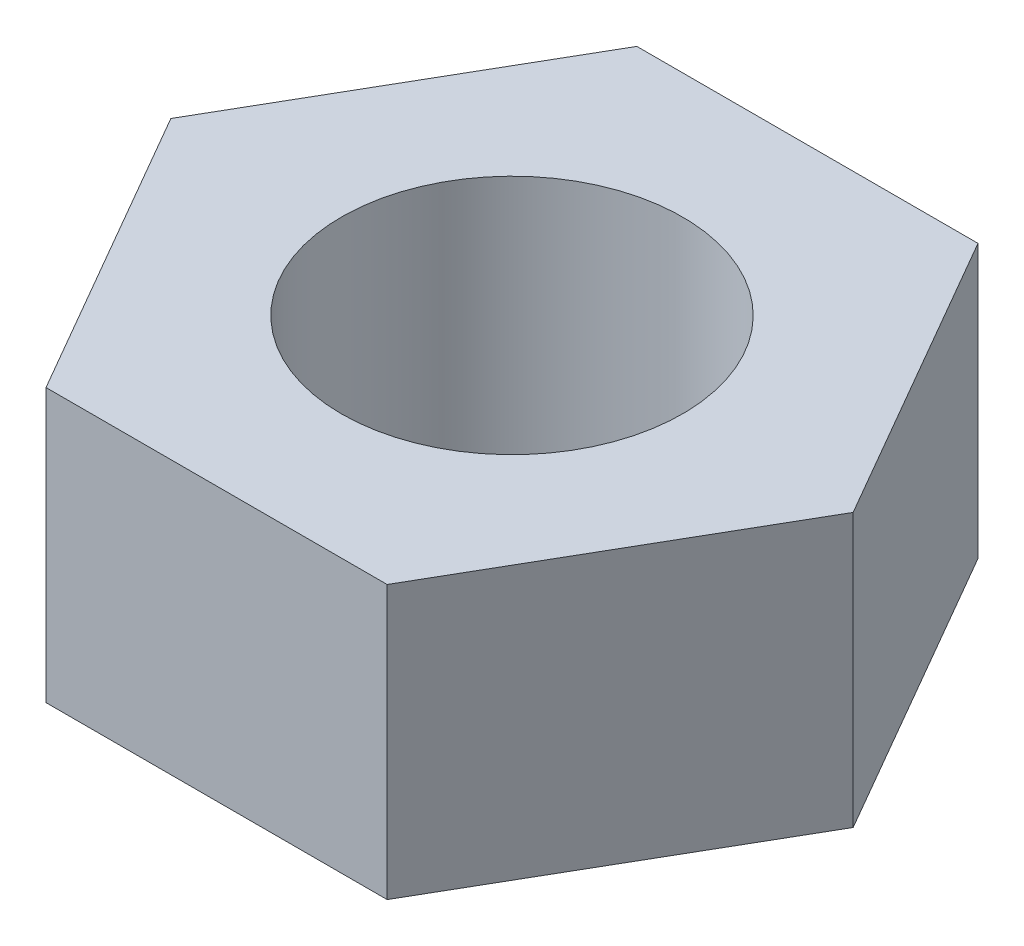
ISO-10303-21;
HEADER;
FILE_DESCRIPTION(('STEP AP214'),'2;1');
FILE_NAME('part.step','',(''),(''),'','','');
FILE_SCHEMA(('AUTOMOTIVE_DESIGN { 1 0 10303 214 1 1 1 1 }'));
ENDSEC;
DATA;
#1=APPLICATION_CONTEXT('core data for automotive mechanical design processes');
#2=APPLICATION_PROTOCOL_DEFINITION('international standard','automotive_design',2000,#1);
#3=PRODUCT_CONTEXT('',#1,'mechanical');
#4=PRODUCT('Part','Part','',(#3));
#5=PRODUCT_RELATED_PRODUCT_CATEGORY('part','',(#4));
#6=PRODUCT_DEFINITION_FORMATION('','',#4);
#7=PRODUCT_DEFINITION_CONTEXT('part definition',#1,'design');
#8=PRODUCT_DEFINITION('design','',#6,#7);
#9=PRODUCT_DEFINITION_SHAPE('','',#8);
#10=(LENGTH_UNIT() NAMED_UNIT(*) SI_UNIT(.MILLI.,.METRE.));
#11=(NAMED_UNIT(*) PLANE_ANGLE_UNIT() SI_UNIT($,.RADIAN.));
#12=(NAMED_UNIT(*) SI_UNIT($,.STERADIAN.) SOLID_ANGLE_UNIT());
#13=UNCERTAINTY_MEASURE_WITH_UNIT(LENGTH_MEASURE(1.E-05),#10,'distance_accuracy_value','');
#14=(GEOMETRIC_REPRESENTATION_CONTEXT(3) GLOBAL_UNCERTAINTY_ASSIGNED_CONTEXT((#13)) GLOBAL_UNIT_ASSIGNED_CONTEXT((#10,
#11,#12)) REPRESENTATION_CONTEXT('',''));
#15=CARTESIAN_POINT('',(0.,0.,0.));
#16=DIRECTION('',(0.,0.,1.));
#17=DIRECTION('',(1.,0.,0.));
#18=AXIS2_PLACEMENT_3D('',#15,#16,#17);
#19=CARTESIAN_POINT('',(0.,3.2,0.));
#20=DIRECTION('',(0.,1.,0.));
#21=DIRECTION('',(0.,0.,1.));
#22=AXIS2_PLACEMENT_3D('',#19,#20,#21);
#23=PLANE('',#22);
#24=DIRECTION('',(0.5,0.,-0.866025403784439));
#25=VECTOR('',#24,1.);
#26=CARTESIAN_POINT('',(2.,3.2,3.46410161513776));
#27=LINE('',#26,#25);
#28=CARTESIAN_POINT('',(2.,3.2,3.46410161513776));
#29=VERTEX_POINT('',#28);
#30=CARTESIAN_POINT('',(4.,3.2,0.));
#31=VERTEX_POINT('',#30);
#32=EDGE_CURVE('E130',#29,#31,#27,.T.);
#33=ORIENTED_EDGE('',*,*,#32,.T.);
#34=DIRECTION('',(-0.5,0.,-0.866025403784438));
#35=VECTOR('',#34,1.);
#36=CARTESIAN_POINT('',(4.,3.2,0.));
#37=LINE('',#36,#35);
#38=CARTESIAN_POINT('',(2.,3.2,-3.46410161513775));
#39=VERTEX_POINT('',#38);
#40=EDGE_CURVE('E88',#31,#39,#37,.T.);
#41=ORIENTED_EDGE('',*,*,#40,.T.);
#42=DIRECTION('',(-1.,0.,0.));
#43=VECTOR('',#42,1.);
#44=CARTESIAN_POINT('',(2.,3.2,-3.46410161513775));
#45=LINE('',#44,#43);
#46=CARTESIAN_POINT('',(-2.,3.2,-3.46410161513775));
#47=VERTEX_POINT('',#46);
#48=EDGE_CURVE('E101',#39,#47,#45,.T.);
#49=ORIENTED_EDGE('',*,*,#48,.T.);
#50=DIRECTION('',(-0.5,0.,0.866025403784439));
#51=VECTOR('',#50,1.);
#52=CARTESIAN_POINT('',(-2.,3.2,-3.46410161513775));
#53=LINE('',#52,#51);
#54=CARTESIAN_POINT('',(-4.,3.2,0.));
#55=VERTEX_POINT('',#54);
#56=EDGE_CURVE('E95',#47,#55,#53,.T.);
#57=ORIENTED_EDGE('',*,*,#56,.T.);
#58=DIRECTION('',(0.5,0.,0.866025403784439));
#59=VECTOR('',#58,1.);
#60=CARTESIAN_POINT('',(-4.,3.2,0.));
#61=LINE('',#60,#59);
#62=CARTESIAN_POINT('',(-2.,3.2,3.46410161513775));
#63=VERTEX_POINT('',#62);
#64=EDGE_CURVE('E99',#55,#63,#61,.T.);
#65=ORIENTED_EDGE('',*,*,#64,.T.);
#66=DIRECTION('',(1.,0.,0.));
#67=VECTOR('',#66,1.);
#68=CARTESIAN_POINT('',(-2.,3.2,3.46410161513775));
#69=LINE('',#68,#67);
#70=EDGE_CURVE('E51',#63,#29,#69,.T.);
#71=ORIENTED_EDGE('',*,*,#70,.T.);
#72=EDGE_LOOP('',(#33,#41,#49,#57,#65,#71));
#73=FACE_BOUND('',#72,.T.);
#74=CARTESIAN_POINT('',(0.,3.2,0.));
#75=DIRECTION('',(0.,1.,0.));
#76=DIRECTION('',(0.,0.,1.));
#77=AXIS2_PLACEMENT_3D('',#74,#75,#76);
#78=CIRCLE('',#77,2.);
#79=CARTESIAN_POINT('',(0.,3.2,2.));
#80=VERTEX_POINT('',#79);
#81=EDGE_CURVE('E123',#80,#80,#78,.T.);
#82=ORIENTED_EDGE('',*,*,#81,.F.);
#83=EDGE_LOOP('',(#82));
#84=FACE_BOUND('',#83,.T.);
#85=ADVANCED_FACE('F34',(#73,#84),#23,.T.);
#86=CARTESIAN_POINT('',(0.,0.,0.));
#87=DIRECTION('',(0.,1.,0.));
#88=DIRECTION('',(0.,0.,1.));
#89=AXIS2_PLACEMENT_3D('',#86,#87,#88);
#90=PLANE('',#89);
#91=DIRECTION('',(0.5,0.,-0.866025403784439));
#92=VECTOR('',#91,1.);
#93=CARTESIAN_POINT('',(2.,0.,3.46410161513776));
#94=LINE('',#93,#92);
#95=CARTESIAN_POINT('',(2.,0.,3.46410161513776));
#96=VERTEX_POINT('',#95);
#97=CARTESIAN_POINT('',(4.,0.,0.));
#98=VERTEX_POINT('',#97);
#99=EDGE_CURVE('E119',#96,#98,#94,.T.);
#100=ORIENTED_EDGE('',*,*,#99,.F.);
#101=DIRECTION('',(1.,0.,0.));
#102=VECTOR('',#101,1.);
#103=CARTESIAN_POINT('',(-2.,0.,3.46410161513775));
#104=LINE('',#103,#102);
#105=CARTESIAN_POINT('',(-2.,0.,3.46410161513775));
#106=VERTEX_POINT('',#105);
#107=EDGE_CURVE('E80',#106,#96,#104,.T.);
#108=ORIENTED_EDGE('',*,*,#107,.F.);
#109=DIRECTION('',(0.5,0.,0.866025403784439));
#110=VECTOR('',#109,1.);
#111=CARTESIAN_POINT('',(-4.,0.,0.));
#112=LINE('',#111,#110);
#113=CARTESIAN_POINT('',(-4.,0.,0.));
#114=VERTEX_POINT('',#113);
#115=EDGE_CURVE('E74',#114,#106,#112,.T.);
#116=ORIENTED_EDGE('',*,*,#115,.F.);
#117=DIRECTION('',(-0.5,0.,0.866025403784439));
#118=VECTOR('',#117,1.);
#119=CARTESIAN_POINT('',(-2.,0.,-3.46410161513775));
#120=LINE('',#119,#118);
#121=CARTESIAN_POINT('',(-2.,0.,-3.46410161513775));
#122=VERTEX_POINT('',#121);
#123=EDGE_CURVE('E109',#122,#114,#120,.T.);
#124=ORIENTED_EDGE('',*,*,#123,.F.);
#125=DIRECTION('',(-1.,0.,0.));
#126=VECTOR('',#125,1.);
#127=CARTESIAN_POINT('',(2.,0.,-3.46410161513775));
#128=LINE('',#127,#126);
#129=CARTESIAN_POINT('',(2.,0.,-3.46410161513775));
#130=VERTEX_POINT('',#129);
#131=EDGE_CURVE('E125',#130,#122,#128,.T.);
#132=ORIENTED_EDGE('',*,*,#131,.F.);
#133=DIRECTION('',(-0.5,0.,-0.866025403784438));
#134=VECTOR('',#133,1.);
#135=CARTESIAN_POINT('',(4.,0.,0.));
#136=LINE('',#135,#134);
#137=EDGE_CURVE('E122',#98,#130,#136,.T.);
#138=ORIENTED_EDGE('',*,*,#137,.F.);
#139=EDGE_LOOP('',(#100,#108,#116,#124,#132,#138));
#140=FACE_BOUND('',#139,.T.);
#141=CARTESIAN_POINT('',(0.,0.,0.));
#142=DIRECTION('',(0.,1.,0.));
#143=DIRECTION('',(0.,0.,1.));
#144=AXIS2_PLACEMENT_3D('',#141,#142,#143);
#145=CIRCLE('',#144,2.);
#146=CARTESIAN_POINT('',(0.,0.,2.));
#147=VERTEX_POINT('',#146);
#148=EDGE_CURVE('E223',#147,#147,#145,.T.);
#149=ORIENTED_EDGE('',*,*,#148,.T.);
#150=EDGE_LOOP('',(#149));
#151=FACE_BOUND('',#150,.T.);
#152=ADVANCED_FACE('F139',(#140,#151),#90,.F.);
#153=CARTESIAN_POINT('',(2.,3.2,3.46410161513776));
#154=DIRECTION('',(-0.866025403784439,0.,-0.5));
#155=DIRECTION('',(-0.5,0.,0.866025403784439));
#156=AXIS2_PLACEMENT_3D('',#153,#154,#155);
#157=PLANE('',#156);
#158=ORIENTED_EDGE('',*,*,#99,.T.);
#159=DIRECTION('',(0.,-1.,0.));
#160=VECTOR('',#159,1.);
#161=CARTESIAN_POINT('',(4.,3.2,0.));
#162=LINE('',#161,#160);
#163=EDGE_CURVE('E11',#31,#98,#162,.T.);
#164=ORIENTED_EDGE('',*,*,#163,.F.);
#165=ORIENTED_EDGE('',*,*,#32,.F.);
#166=DIRECTION('',(0.,-1.,0.));
#167=VECTOR('',#166,1.);
#168=CARTESIAN_POINT('',(2.,3.2,3.46410161513776));
#169=LINE('',#168,#167);
#170=EDGE_CURVE('E115',#29,#96,#169,.T.);
#171=ORIENTED_EDGE('',*,*,#170,.T.);
#172=EDGE_LOOP('',(#158,#164,#165,#171));
#173=FACE_BOUND('',#172,.T.);
#174=ADVANCED_FACE('F36',(#173),#157,.F.);
#175=CARTESIAN_POINT('',(4.,3.2,0.));
#176=DIRECTION('',(-0.866025403784438,0.,0.5));
#177=DIRECTION('',(0.5,0.,0.866025403784439));
#178=AXIS2_PLACEMENT_3D('',#175,#176,#177);
#179=PLANE('',#178);
#180=ORIENTED_EDGE('',*,*,#137,.T.);
#181=DIRECTION('',(0.,-1.,0.));
#182=VECTOR('',#181,1.);
#183=CARTESIAN_POINT('',(2.,3.2,-3.46410161513775));
#184=LINE('',#183,#182);
#185=EDGE_CURVE('E43',#39,#130,#184,.T.);
#186=ORIENTED_EDGE('',*,*,#185,.F.);
#187=ORIENTED_EDGE('',*,*,#40,.F.);
#188=ORIENTED_EDGE('',*,*,#163,.T.);
#189=EDGE_LOOP('',(#180,#186,#187,#188));
#190=FACE_BOUND('',#189,.T.);
#191=ADVANCED_FACE('F164',(#190),#179,.F.);
#192=CARTESIAN_POINT('',(2.,3.2,-3.46410161513775));
#193=DIRECTION('',(0.,0.,1.));
#194=DIRECTION('',(1.,0.,0.));
#195=AXIS2_PLACEMENT_3D('',#192,#193,#194);
#196=PLANE('',#195);
#197=ORIENTED_EDGE('',*,*,#131,.T.);
#198=DIRECTION('',(0.,-1.,0.));
#199=VECTOR('',#198,1.);
#200=CARTESIAN_POINT('',(-2.,3.2,-3.46410161513775));
#201=LINE('',#200,#199);
#202=EDGE_CURVE('E110',#47,#122,#201,.T.);
#203=ORIENTED_EDGE('',*,*,#202,.F.);
#204=ORIENTED_EDGE('',*,*,#48,.F.);
#205=ORIENTED_EDGE('',*,*,#185,.T.);
#206=EDGE_LOOP('',(#197,#203,#204,#205));
#207=FACE_BOUND('',#206,.T.);
#208=ADVANCED_FACE('F136',(#207),#196,.F.);
#209=CARTESIAN_POINT('',(-2.,3.2,-3.46410161513775));
#210=DIRECTION('',(0.866025403784439,0.,0.5));
#211=DIRECTION('',(0.5,0.,-0.866025403784439));
#212=AXIS2_PLACEMENT_3D('',#209,#210,#211);
#213=PLANE('',#212);
#214=ORIENTED_EDGE('',*,*,#123,.T.);
#215=DIRECTION('',(0.,-1.,0.));
#216=VECTOR('',#215,1.);
#217=CARTESIAN_POINT('',(-4.,3.2,0.));
#218=LINE('',#217,#216);
#219=EDGE_CURVE('E106',#55,#114,#218,.T.);
#220=ORIENTED_EDGE('',*,*,#219,.F.);
#221=ORIENTED_EDGE('',*,*,#56,.F.);
#222=ORIENTED_EDGE('',*,*,#202,.T.);
#223=EDGE_LOOP('',(#214,#220,#221,#222));
#224=FACE_BOUND('',#223,.T.);
#225=ADVANCED_FACE('F107',(#224),#213,.F.);
#226=CARTESIAN_POINT('',(-4.,3.2,0.));
#227=DIRECTION('',(0.866025403784439,0.,-0.5));
#228=DIRECTION('',(-0.5,0.,-0.866025403784439));
#229=AXIS2_PLACEMENT_3D('',#226,#227,#228);
#230=PLANE('',#229);
#231=ORIENTED_EDGE('',*,*,#115,.T.);
#232=DIRECTION('',(0.,-1.,0.));
#233=VECTOR('',#232,1.);
#234=CARTESIAN_POINT('',(-2.,3.2,3.46410161513775));
#235=LINE('',#234,#233);
#236=EDGE_CURVE('E111',#63,#106,#235,.T.);
#237=ORIENTED_EDGE('',*,*,#236,.F.);
#238=ORIENTED_EDGE('',*,*,#64,.F.);
#239=ORIENTED_EDGE('',*,*,#219,.T.);
#240=EDGE_LOOP('',(#231,#237,#238,#239));
#241=FACE_BOUND('',#240,.T.);
#242=ADVANCED_FACE('F113',(#241),#230,.F.);
#243=CARTESIAN_POINT('',(-2.,3.2,3.46410161513775));
#244=DIRECTION('',(0.,0.,-1.));
#245=DIRECTION('',(-1.,0.,0.));
#246=AXIS2_PLACEMENT_3D('',#243,#244,#245);
#247=PLANE('',#246);
#248=ORIENTED_EDGE('',*,*,#107,.T.);
#249=ORIENTED_EDGE('',*,*,#170,.F.);
#250=ORIENTED_EDGE('',*,*,#70,.F.);
#251=ORIENTED_EDGE('',*,*,#236,.T.);
#252=EDGE_LOOP('',(#248,#249,#250,#251));
#253=FACE_BOUND('',#252,.T.);
#254=ADVANCED_FACE('F144',(#253),#247,.F.);
#255=CARTESIAN_POINT('',(0.,3.2,0.));
#256=DIRECTION('',(0.,-1.,0.));
#257=DIRECTION('',(0.,0.,-1.));
#258=AXIS2_PLACEMENT_3D('',#255,#256,#257);
#259=CYLINDRICAL_SURFACE('',#258,2.);
#260=ORIENTED_EDGE('',*,*,#81,.T.);
#261=EDGE_LOOP('',(#260));
#262=FACE_BOUND('',#261,.T.);
#263=ORIENTED_EDGE('',*,*,#148,.F.);
#264=EDGE_LOOP('',(#263));
#265=FACE_BOUND('',#264,.T.);
#266=ADVANCED_FACE('F146',(#262,#265),#259,.F.);
#267=CLOSED_SHELL('',(#85,#152,#174,#191,#208,#225,#242,#254,#266));
#268=MANIFOLD_SOLID_BREP('B2',#267);
#269=ADVANCED_BREP_SHAPE_REPRESENTATION('',(#18,#268),#14);
#270=SHAPE_DEFINITION_REPRESENTATION(#9,#269);
ENDSEC;
END-ISO-10303-21;
